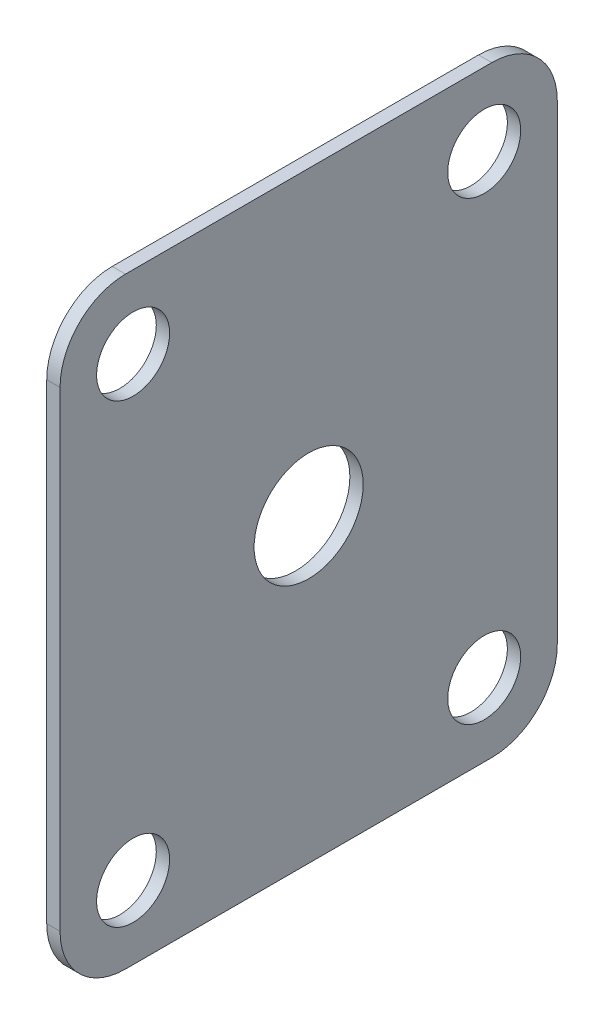
ISO-10303-21;
HEADER;
FILE_DESCRIPTION(('STEP AP214'),'2;1');
FILE_NAME('part.step','',(''),(''),'','','');
FILE_SCHEMA(('AUTOMOTIVE_DESIGN { 1 0 10303 214 1 1 1 1 }'));
ENDSEC;
DATA;
#1=APPLICATION_CONTEXT('core data for automotive mechanical design processes');
#2=APPLICATION_PROTOCOL_DEFINITION('international standard','automotive_design',2000,#1);
#3=PRODUCT_CONTEXT('',#1,'mechanical');
#4=PRODUCT('Part','Part','',(#3));
#5=PRODUCT_RELATED_PRODUCT_CATEGORY('part','',(#4));
#6=PRODUCT_DEFINITION_FORMATION('','',#4);
#7=PRODUCT_DEFINITION_CONTEXT('part definition',#1,'design');
#8=PRODUCT_DEFINITION('design','',#6,#7);
#9=PRODUCT_DEFINITION_SHAPE('','',#8);
#10=(LENGTH_UNIT() NAMED_UNIT(*) SI_UNIT(.MILLI.,.METRE.));
#11=(NAMED_UNIT(*) PLANE_ANGLE_UNIT() SI_UNIT($,.RADIAN.));
#12=(NAMED_UNIT(*) SI_UNIT($,.STERADIAN.) SOLID_ANGLE_UNIT());
#13=UNCERTAINTY_MEASURE_WITH_UNIT(LENGTH_MEASURE(1.E-05),#10,'distance_accuracy_value','');
#14=(GEOMETRIC_REPRESENTATION_CONTEXT(3) GLOBAL_UNCERTAINTY_ASSIGNED_CONTEXT((#13)) GLOBAL_UNIT_ASSIGNED_CONTEXT((#10,
#11,#12)) REPRESENTATION_CONTEXT('',''));
#15=CARTESIAN_POINT('',(0.,0.,0.));
#16=DIRECTION('',(0.,0.,1.));
#17=DIRECTION('',(1.,0.,0.));
#18=AXIS2_PLACEMENT_3D('',#15,#16,#17);
#19=CARTESIAN_POINT('',(1.5494,0.,0.));
#20=DIRECTION('',(-1.,0.,0.));
#21=DIRECTION('',(0.,0.,1.));
#22=AXIS2_PLACEMENT_3D('',#19,#20,#21);
#23=PLANE('',#22);
#24=DIRECTION('',(0.,0.,-1.));
#25=VECTOR('',#24,1.);
#26=CARTESIAN_POINT('',(1.5494,-35.052,28.956));
#27=LINE('',#26,#25);
#28=CARTESIAN_POINT('',(1.5494,-35.052,21.336));
#29=VERTEX_POINT('',#28);
#30=CARTESIAN_POINT('',(1.5494,-35.052,-21.336));
#31=VERTEX_POINT('',#30);
#32=EDGE_CURVE('E141',#29,#31,#27,.T.);
#33=ORIENTED_EDGE('',*,*,#32,.T.);
#34=CARTESIAN_POINT('',(1.5494,-27.432,-21.336));
#35=DIRECTION('',(-1.,0.,0.));
#36=DIRECTION('',(0.,0.,1.));
#37=AXIS2_PLACEMENT_3D('',#34,#35,#36);
#38=CIRCLE('',#37,7.62);
#39=CARTESIAN_POINT('',(1.5494,-27.432,-28.956));
#40=VERTEX_POINT('',#39);
#41=EDGE_CURVE('E159',#31,#40,#38,.F.);
#42=ORIENTED_EDGE('',*,*,#41,.T.);
#43=DIRECTION('',(0.,1.,0.));
#44=VECTOR('',#43,1.);
#45=CARTESIAN_POINT('',(1.5494,-35.052,-28.956));
#46=LINE('',#45,#44);
#47=CARTESIAN_POINT('',(1.5494,27.432,-28.956));
#48=VERTEX_POINT('',#47);
#49=EDGE_CURVE('E123',#40,#48,#46,.T.);
#50=ORIENTED_EDGE('',*,*,#49,.T.);
#51=CARTESIAN_POINT('',(1.5494,27.432,-21.336));
#52=DIRECTION('',(-1.,0.,0.));
#53=DIRECTION('',(0.,0.,1.));
#54=AXIS2_PLACEMENT_3D('',#51,#52,#53);
#55=CIRCLE('',#54,7.62);
#56=CARTESIAN_POINT('',(1.5494,35.052,-21.336));
#57=VERTEX_POINT('',#56);
#58=EDGE_CURVE('E155',#48,#57,#55,.F.);
#59=ORIENTED_EDGE('',*,*,#58,.T.);
#60=DIRECTION('',(0.,0.,1.));
#61=VECTOR('',#60,1.);
#62=CARTESIAN_POINT('',(1.5494,35.052,28.956));
#63=LINE('',#62,#61);
#64=CARTESIAN_POINT('',(1.5494,35.052,21.336));
#65=VERTEX_POINT('',#64);
#66=EDGE_CURVE('E168',#57,#65,#63,.T.);
#67=ORIENTED_EDGE('',*,*,#66,.T.);
#68=CARTESIAN_POINT('',(1.5494,27.432,21.336));
#69=DIRECTION('',(-1.,0.,0.));
#70=DIRECTION('',(0.,0.,1.));
#71=AXIS2_PLACEMENT_3D('',#68,#69,#70);
#72=CIRCLE('',#71,7.62);
#73=CARTESIAN_POINT('',(1.5494,27.432,28.956));
#74=VERTEX_POINT('',#73);
#75=EDGE_CURVE('E58',#65,#74,#72,.F.);
#76=ORIENTED_EDGE('',*,*,#75,.T.);
#77=DIRECTION('',(0.,-1.,0.));
#78=VECTOR('',#77,1.);
#79=CARTESIAN_POINT('',(1.5494,-35.052,28.956));
#80=LINE('',#79,#78);
#81=CARTESIAN_POINT('',(1.5494,-27.432,28.956));
#82=VERTEX_POINT('',#81);
#83=EDGE_CURVE('E174',#74,#82,#80,.T.);
#84=ORIENTED_EDGE('',*,*,#83,.T.);
#85=CARTESIAN_POINT('',(1.5494,-27.432,21.336));
#86=DIRECTION('',(-1.,0.,0.));
#87=DIRECTION('',(0.,0.,1.));
#88=AXIS2_PLACEMENT_3D('',#85,#86,#87);
#89=CIRCLE('',#88,7.62);
#90=EDGE_CURVE('E157',#82,#29,#89,.F.);
#91=ORIENTED_EDGE('',*,*,#90,.T.);
#92=EDGE_LOOP('',(#33,#42,#50,#59,#67,#76,#84,#91));
#93=FACE_BOUND('',#92,.T.);
#94=CARTESIAN_POINT('',(1.5494,26.543,20.447));
#95=DIRECTION('',(1.,0.,0.));
#96=DIRECTION('',(0.,0.,-1.));
#97=AXIS2_PLACEMENT_3D('',#94,#95,#96);
#98=CIRCLE('',#97,4.25);
#99=CARTESIAN_POINT('',(1.5494,26.543,16.197));
#100=VERTEX_POINT('',#99);
#101=EDGE_CURVE('E132',#100,#100,#98,.T.);
#102=ORIENTED_EDGE('',*,*,#101,.F.);
#103=EDGE_LOOP('',(#102));
#104=FACE_BOUND('',#103,.T.);
#105=CARTESIAN_POINT('',(1.5494,26.543,-20.447));
#106=DIRECTION('',(1.,0.,0.));
#107=DIRECTION('',(0.,0.,-1.));
#108=AXIS2_PLACEMENT_3D('',#105,#106,#107);
#109=CIRCLE('',#108,4.25);
#110=CARTESIAN_POINT('',(1.5494,26.543,-24.697));
#111=VERTEX_POINT('',#110);
#112=EDGE_CURVE('E189',#111,#111,#109,.T.);
#113=ORIENTED_EDGE('',*,*,#112,.F.);
#114=EDGE_LOOP('',(#113));
#115=FACE_BOUND('',#114,.T.);
#116=CARTESIAN_POINT('',(1.5494,-26.543,-20.447));
#117=DIRECTION('',(1.,0.,0.));
#118=DIRECTION('',(0.,0.,-1.));
#119=AXIS2_PLACEMENT_3D('',#116,#117,#118);
#120=CIRCLE('',#119,4.25);
#121=CARTESIAN_POINT('',(1.5494,-26.543,-24.697));
#122=VERTEX_POINT('',#121);
#123=EDGE_CURVE('E194',#122,#122,#120,.T.);
#124=ORIENTED_EDGE('',*,*,#123,.F.);
#125=EDGE_LOOP('',(#124));
#126=FACE_BOUND('',#125,.T.);
#127=CARTESIAN_POINT('',(1.5494,-26.543,20.447));
#128=DIRECTION('',(1.,0.,0.));
#129=DIRECTION('',(0.,0.,-1.));
#130=AXIS2_PLACEMENT_3D('',#127,#128,#129);
#131=CIRCLE('',#130,4.25);
#132=CARTESIAN_POINT('',(1.5494,-26.543,16.197));
#133=VERTEX_POINT('',#132);
#134=EDGE_CURVE('E200',#133,#133,#131,.T.);
#135=ORIENTED_EDGE('',*,*,#134,.F.);
#136=EDGE_LOOP('',(#135));
#137=FACE_BOUND('',#136,.T.);
#138=CARTESIAN_POINT('',(1.5494,0.,0.));
#139=DIRECTION('',(1.,0.,0.));
#140=DIRECTION('',(0.,0.,-1.));
#141=AXIS2_PLACEMENT_3D('',#138,#139,#140);
#142=CIRCLE('',#141,6.35);
#143=CARTESIAN_POINT('',(1.5494,0.,-6.34999999999999));
#144=VERTEX_POINT('',#143);
#145=EDGE_CURVE('E206',#144,#144,#142,.T.);
#146=ORIENTED_EDGE('',*,*,#145,.F.);
#147=EDGE_LOOP('',(#146));
#148=FACE_BOUND('',#147,.T.);
#149=ADVANCED_FACE('F36',(#93,#104,#115,#126,#137,#148),#23,.F.);
#150=CARTESIAN_POINT('',(0.,0.,0.));
#151=DIRECTION('',(-1.,0.,0.));
#152=DIRECTION('',(0.,0.,1.));
#153=AXIS2_PLACEMENT_3D('',#150,#151,#152);
#154=PLANE('',#153);
#155=CARTESIAN_POINT('',(0.,-26.543,20.447));
#156=DIRECTION('',(1.,0.,0.));
#157=DIRECTION('',(0.,0.,-1.));
#158=AXIS2_PLACEMENT_3D('',#155,#156,#157);
#159=CIRCLE('',#158,4.25);
#160=CARTESIAN_POINT('',(0.,-26.543,16.197));
#161=VERTEX_POINT('',#160);
#162=EDGE_CURVE('E203',#161,#161,#159,.T.);
#163=ORIENTED_EDGE('',*,*,#162,.T.);
#164=EDGE_LOOP('',(#163));
#165=FACE_BOUND('',#164,.T.);
#166=CARTESIAN_POINT('',(0.,26.543,-20.447));
#167=DIRECTION('',(1.,0.,0.));
#168=DIRECTION('',(0.,0.,-1.));
#169=AXIS2_PLACEMENT_3D('',#166,#167,#168);
#170=CIRCLE('',#169,4.25);
#171=CARTESIAN_POINT('',(0.,26.543,-24.697));
#172=VERTEX_POINT('',#171);
#173=EDGE_CURVE('E191',#172,#172,#170,.T.);
#174=ORIENTED_EDGE('',*,*,#173,.T.);
#175=EDGE_LOOP('',(#174));
#176=FACE_BOUND('',#175,.T.);
#177=DIRECTION('',(0.,1.,0.));
#178=VECTOR('',#177,1.);
#179=CARTESIAN_POINT('',(0.,-35.052,-28.956));
#180=LINE('',#179,#178);
#181=CARTESIAN_POINT('',(0.,-27.432,-28.956));
#182=VERTEX_POINT('',#181);
#183=CARTESIAN_POINT('',(0.,27.432,-28.956));
#184=VERTEX_POINT('',#183);
#185=EDGE_CURVE('E120',#182,#184,#180,.T.);
#186=ORIENTED_EDGE('',*,*,#185,.F.);
#187=CARTESIAN_POINT('',(0.,-27.432,-21.336));
#188=DIRECTION('',(-1.,0.,0.));
#189=DIRECTION('',(0.,0.,1.));
#190=AXIS2_PLACEMENT_3D('',#187,#188,#189);
#191=CIRCLE('',#190,7.62);
#192=CARTESIAN_POINT('',(0.,-35.052,-21.336));
#193=VERTEX_POINT('',#192);
#194=EDGE_CURVE('E103',#182,#193,#191,.T.);
#195=ORIENTED_EDGE('',*,*,#194,.T.);
#196=DIRECTION('',(0.,0.,-1.));
#197=VECTOR('',#196,1.);
#198=CARTESIAN_POINT('',(0.,-35.052,28.956));
#199=LINE('',#198,#197);
#200=CARTESIAN_POINT('',(0.,-35.052,21.336));
#201=VERTEX_POINT('',#200);
#202=EDGE_CURVE('E145',#201,#193,#199,.T.);
#203=ORIENTED_EDGE('',*,*,#202,.F.);
#204=CARTESIAN_POINT('',(0.,-27.432,21.336));
#205=DIRECTION('',(-1.,0.,0.));
#206=DIRECTION('',(0.,0.,1.));
#207=AXIS2_PLACEMENT_3D('',#204,#205,#206);
#208=CIRCLE('',#207,7.62);
#209=CARTESIAN_POINT('',(0.,-27.432,28.956));
#210=VERTEX_POINT('',#209);
#211=EDGE_CURVE('E114',#201,#210,#208,.T.);
#212=ORIENTED_EDGE('',*,*,#211,.T.);
#213=DIRECTION('',(0.,-1.,0.));
#214=VECTOR('',#213,1.);
#215=CARTESIAN_POINT('',(0.,-35.052,28.956));
#216=LINE('',#215,#214);
#217=CARTESIAN_POINT('',(0.,27.432,28.956));
#218=VERTEX_POINT('',#217);
#219=EDGE_CURVE('E135',#218,#210,#216,.T.);
#220=ORIENTED_EDGE('',*,*,#219,.F.);
#221=CARTESIAN_POINT('',(0.,27.432,21.336));
#222=DIRECTION('',(-1.,0.,0.));
#223=DIRECTION('',(0.,0.,1.));
#224=AXIS2_PLACEMENT_3D('',#221,#222,#223);
#225=CIRCLE('',#224,7.62);
#226=CARTESIAN_POINT('',(0.,35.052,21.336));
#227=VERTEX_POINT('',#226);
#228=EDGE_CURVE('E124',#218,#227,#225,.T.);
#229=ORIENTED_EDGE('',*,*,#228,.T.);
#230=DIRECTION('',(0.,0.,1.));
#231=VECTOR('',#230,1.);
#232=CARTESIAN_POINT('',(0.,35.052,28.956));
#233=LINE('',#232,#231);
#234=CARTESIAN_POINT('',(0.,35.052,-21.336));
#235=VERTEX_POINT('',#234);
#236=EDGE_CURVE('E131',#235,#227,#233,.T.);
#237=ORIENTED_EDGE('',*,*,#236,.F.);
#238=CARTESIAN_POINT('',(0.,27.432,-21.336));
#239=DIRECTION('',(-1.,0.,0.));
#240=DIRECTION('',(0.,0.,1.));
#241=AXIS2_PLACEMENT_3D('',#238,#239,#240);
#242=CIRCLE('',#241,7.62);
#243=EDGE_CURVE('E130',#235,#184,#242,.T.);
#244=ORIENTED_EDGE('',*,*,#243,.T.);
#245=EDGE_LOOP('',(#186,#195,#203,#212,#220,#229,#237,#244));
#246=FACE_BOUND('',#245,.T.);
#247=CARTESIAN_POINT('',(0.,26.543,20.447));
#248=DIRECTION('',(1.,0.,0.));
#249=DIRECTION('',(0.,0.,-1.));
#250=AXIS2_PLACEMENT_3D('',#247,#248,#249);
#251=CIRCLE('',#250,4.25);
#252=CARTESIAN_POINT('',(0.,26.543,16.197));
#253=VERTEX_POINT('',#252);
#254=EDGE_CURVE('E138',#253,#253,#251,.T.);
#255=ORIENTED_EDGE('',*,*,#254,.T.);
#256=EDGE_LOOP('',(#255));
#257=FACE_BOUND('',#256,.T.);
#258=CARTESIAN_POINT('',(0.,-26.543,-20.447));
#259=DIRECTION('',(1.,0.,0.));
#260=DIRECTION('',(0.,0.,-1.));
#261=AXIS2_PLACEMENT_3D('',#258,#259,#260);
#262=CIRCLE('',#261,4.25);
#263=CARTESIAN_POINT('',(0.,-26.543,-24.697));
#264=VERTEX_POINT('',#263);
#265=EDGE_CURVE('E197',#264,#264,#262,.T.);
#266=ORIENTED_EDGE('',*,*,#265,.T.);
#267=EDGE_LOOP('',(#266));
#268=FACE_BOUND('',#267,.T.);
#269=CARTESIAN_POINT('',(0.,0.,0.));
#270=DIRECTION('',(1.,0.,0.));
#271=DIRECTION('',(0.,0.,-1.));
#272=AXIS2_PLACEMENT_3D('',#269,#270,#271);
#273=CIRCLE('',#272,6.35);
#274=CARTESIAN_POINT('',(0.,0.,-6.34999999999999));
#275=VERTEX_POINT('',#274);
#276=EDGE_CURVE('E209',#275,#275,#273,.T.);
#277=ORIENTED_EDGE('',*,*,#276,.T.);
#278=EDGE_LOOP('',(#277));
#279=FACE_BOUND('',#278,.T.);
#280=ADVANCED_FACE('F127',(#165,#176,#246,#257,#268,#279),#154,.T.);
#281=CARTESIAN_POINT('',(1.5494,-35.052,-28.956));
#282=DIRECTION('',(0.,0.,1.));
#283=DIRECTION('',(1.,0.,0.));
#284=AXIS2_PLACEMENT_3D('',#281,#282,#283);
#285=PLANE('',#284);
#286=ORIENTED_EDGE('',*,*,#49,.F.);
#287=DIRECTION('',(-1.,0.,0.));
#288=VECTOR('',#287,1.);
#289=CARTESIAN_POINT('',(1.5494,-27.432,-28.956));
#290=LINE('',#289,#288);
#291=EDGE_CURVE('E107',#40,#182,#290,.T.);
#292=ORIENTED_EDGE('',*,*,#291,.T.);
#293=ORIENTED_EDGE('',*,*,#185,.T.);
#294=DIRECTION('',(-1.,0.,0.));
#295=VECTOR('',#294,1.);
#296=CARTESIAN_POINT('',(1.5494,27.432,-28.956));
#297=LINE('',#296,#295);
#298=EDGE_CURVE('E125',#184,#48,#297,.F.);
#299=ORIENTED_EDGE('',*,*,#298,.T.);
#300=EDGE_LOOP('',(#286,#292,#293,#299));
#301=FACE_BOUND('',#300,.T.);
#302=ADVANCED_FACE('F119',(#301),#285,.F.);
#303=CARTESIAN_POINT('',(1.5494,35.052,28.956));
#304=DIRECTION('',(0.,-1.,0.));
#305=DIRECTION('',(0.,0.,-1.));
#306=AXIS2_PLACEMENT_3D('',#303,#304,#305);
#307=PLANE('',#306);
#308=ORIENTED_EDGE('',*,*,#66,.F.);
#309=DIRECTION('',(-1.,0.,0.));
#310=VECTOR('',#309,1.);
#311=CARTESIAN_POINT('',(1.5494,35.052,-21.336));
#312=LINE('',#311,#310);
#313=EDGE_CURVE('E11',#57,#235,#312,.T.);
#314=ORIENTED_EDGE('',*,*,#313,.T.);
#315=ORIENTED_EDGE('',*,*,#236,.T.);
#316=DIRECTION('',(-1.,0.,0.));
#317=VECTOR('',#316,1.);
#318=CARTESIAN_POINT('',(1.5494,35.052,21.336));
#319=LINE('',#318,#317);
#320=EDGE_CURVE('E44',#227,#65,#319,.F.);
#321=ORIENTED_EDGE('',*,*,#320,.T.);
#322=EDGE_LOOP('',(#308,#314,#315,#321));
#323=FACE_BOUND('',#322,.T.);
#324=ADVANCED_FACE('F167',(#323),#307,.F.);
#325=CARTESIAN_POINT('',(1.5494,-35.052,28.956));
#326=DIRECTION('',(0.,0.,-1.));
#327=DIRECTION('',(-1.,0.,0.));
#328=AXIS2_PLACEMENT_3D('',#325,#326,#327);
#329=PLANE('',#328);
#330=ORIENTED_EDGE('',*,*,#219,.T.);
#331=DIRECTION('',(-1.,0.,0.));
#332=VECTOR('',#331,1.);
#333=CARTESIAN_POINT('',(1.5494,-27.432,28.956));
#334=LINE('',#333,#332);
#335=EDGE_CURVE('E51',#210,#82,#334,.F.);
#336=ORIENTED_EDGE('',*,*,#335,.T.);
#337=ORIENTED_EDGE('',*,*,#83,.F.);
#338=DIRECTION('',(-1.,0.,0.));
#339=VECTOR('',#338,1.);
#340=CARTESIAN_POINT('',(1.5494,27.432,28.956));
#341=LINE('',#340,#339);
#342=EDGE_CURVE('E161',#74,#218,#341,.T.);
#343=ORIENTED_EDGE('',*,*,#342,.T.);
#344=EDGE_LOOP('',(#330,#336,#337,#343));
#345=FACE_BOUND('',#344,.T.);
#346=ADVANCED_FACE('F178',(#345),#329,.F.);
#347=CARTESIAN_POINT('',(1.5494,-35.052,28.956));
#348=DIRECTION('',(0.,1.,0.));
#349=DIRECTION('',(0.,0.,1.));
#350=AXIS2_PLACEMENT_3D('',#347,#348,#349);
#351=PLANE('',#350);
#352=ORIENTED_EDGE('',*,*,#202,.T.);
#353=DIRECTION('',(-1.,0.,0.));
#354=VECTOR('',#353,1.);
#355=CARTESIAN_POINT('',(1.5494,-35.052,-21.336));
#356=LINE('',#355,#354);
#357=EDGE_CURVE('E108',#193,#31,#356,.F.);
#358=ORIENTED_EDGE('',*,*,#357,.T.);
#359=ORIENTED_EDGE('',*,*,#32,.F.);
#360=DIRECTION('',(-1.,0.,0.));
#361=VECTOR('',#360,1.);
#362=CARTESIAN_POINT('',(1.5494,-35.052,21.336));
#363=LINE('',#362,#361);
#364=EDGE_CURVE('E113',#29,#201,#363,.T.);
#365=ORIENTED_EDGE('',*,*,#364,.T.);
#366=EDGE_LOOP('',(#352,#358,#359,#365));
#367=FACE_BOUND('',#366,.T.);
#368=ADVANCED_FACE('F185',(#367),#351,.F.);
#369=CARTESIAN_POINT('',(1.5494,26.543,20.447));
#370=DIRECTION('',(-1.,0.,0.));
#371=DIRECTION('',(0.,0.,1.));
#372=AXIS2_PLACEMENT_3D('',#369,#370,#371);
#373=CYLINDRICAL_SURFACE('',#372,4.25);
#374=ORIENTED_EDGE('',*,*,#101,.T.);
#375=EDGE_LOOP('',(#374));
#376=FACE_BOUND('',#375,.T.);
#377=ORIENTED_EDGE('',*,*,#254,.F.);
#378=EDGE_LOOP('',(#377));
#379=FACE_BOUND('',#378,.T.);
#380=ADVANCED_FACE('F226',(#376,#379),#373,.F.);
#381=CARTESIAN_POINT('',(1.5494,26.543,-20.447));
#382=DIRECTION('',(-1.,0.,0.));
#383=DIRECTION('',(0.,0.,1.));
#384=AXIS2_PLACEMENT_3D('',#381,#382,#383);
#385=CYLINDRICAL_SURFACE('',#384,4.25);
#386=ORIENTED_EDGE('',*,*,#112,.T.);
#387=EDGE_LOOP('',(#386));
#388=FACE_BOUND('',#387,.T.);
#389=ORIENTED_EDGE('',*,*,#173,.F.);
#390=EDGE_LOOP('',(#389));
#391=FACE_BOUND('',#390,.T.);
#392=ADVANCED_FACE('F328',(#388,#391),#385,.F.);
#393=CARTESIAN_POINT('',(1.5494,-26.543,-20.447));
#394=DIRECTION('',(-1.,0.,0.));
#395=DIRECTION('',(0.,0.,1.));
#396=AXIS2_PLACEMENT_3D('',#393,#394,#395);
#397=CYLINDRICAL_SURFACE('',#396,4.25);
#398=ORIENTED_EDGE('',*,*,#123,.T.);
#399=EDGE_LOOP('',(#398));
#400=FACE_BOUND('',#399,.T.);
#401=ORIENTED_EDGE('',*,*,#265,.F.);
#402=EDGE_LOOP('',(#401));
#403=FACE_BOUND('',#402,.T.);
#404=ADVANCED_FACE('F318',(#400,#403),#397,.F.);
#405=CARTESIAN_POINT('',(1.5494,-26.543,20.447));
#406=DIRECTION('',(-1.,0.,0.));
#407=DIRECTION('',(0.,0.,1.));
#408=AXIS2_PLACEMENT_3D('',#405,#406,#407);
#409=CYLINDRICAL_SURFACE('',#408,4.25);
#410=ORIENTED_EDGE('',*,*,#134,.T.);
#411=EDGE_LOOP('',(#410));
#412=FACE_BOUND('',#411,.T.);
#413=ORIENTED_EDGE('',*,*,#162,.F.);
#414=EDGE_LOOP('',(#413));
#415=FACE_BOUND('',#414,.T.);
#416=ADVANCED_FACE('F309',(#412,#415),#409,.F.);
#417=CARTESIAN_POINT('',(1.5494,0.,0.));
#418=DIRECTION('',(-1.,0.,0.));
#419=DIRECTION('',(0.,0.,1.));
#420=AXIS2_PLACEMENT_3D('',#417,#418,#419);
#421=CYLINDRICAL_SURFACE('',#420,6.35);
#422=ORIENTED_EDGE('',*,*,#145,.T.);
#423=EDGE_LOOP('',(#422));
#424=FACE_BOUND('',#423,.T.);
#425=ORIENTED_EDGE('',*,*,#276,.F.);
#426=EDGE_LOOP('',(#425));
#427=FACE_BOUND('',#426,.T.);
#428=ADVANCED_FACE('F215',(#424,#427),#421,.F.);
#429=CARTESIAN_POINT('',(1.5494,-27.432,-21.336));
#430=DIRECTION('',(-1.,0.,0.));
#431=DIRECTION('',(0.,0.,1.));
#432=AXIS2_PLACEMENT_3D('',#429,#430,#431);
#433=CYLINDRICAL_SURFACE('',#432,7.62);
#434=ORIENTED_EDGE('',*,*,#41,.F.);
#435=ORIENTED_EDGE('',*,*,#357,.F.);
#436=ORIENTED_EDGE('',*,*,#194,.F.);
#437=ORIENTED_EDGE('',*,*,#291,.F.);
#438=EDGE_LOOP('',(#434,#435,#436,#437));
#439=FACE_BOUND('',#438,.T.);
#440=ADVANCED_FACE('F106',(#439),#433,.T.);
#441=CARTESIAN_POINT('',(1.5494,-27.432,21.336));
#442=DIRECTION('',(-1.,0.,0.));
#443=DIRECTION('',(0.,0.,1.));
#444=AXIS2_PLACEMENT_3D('',#441,#442,#443);
#445=CYLINDRICAL_SURFACE('',#444,7.62);
#446=ORIENTED_EDGE('',*,*,#90,.F.);
#447=ORIENTED_EDGE('',*,*,#335,.F.);
#448=ORIENTED_EDGE('',*,*,#211,.F.);
#449=ORIENTED_EDGE('',*,*,#364,.F.);
#450=EDGE_LOOP('',(#446,#447,#448,#449));
#451=FACE_BOUND('',#450,.T.);
#452=ADVANCED_FACE('F182',(#451),#445,.T.);
#453=CARTESIAN_POINT('',(1.5494,27.432,-21.336));
#454=DIRECTION('',(-1.,0.,0.));
#455=DIRECTION('',(0.,0.,1.));
#456=AXIS2_PLACEMENT_3D('',#453,#454,#455);
#457=CYLINDRICAL_SURFACE('',#456,7.62);
#458=ORIENTED_EDGE('',*,*,#58,.F.);
#459=ORIENTED_EDGE('',*,*,#298,.F.);
#460=ORIENTED_EDGE('',*,*,#243,.F.);
#461=ORIENTED_EDGE('',*,*,#313,.F.);
#462=EDGE_LOOP('',(#458,#459,#460,#461));
#463=FACE_BOUND('',#462,.T.);
#464=ADVANCED_FACE('F240',(#463),#457,.T.);
#465=CARTESIAN_POINT('',(1.5494,27.432,21.336));
#466=DIRECTION('',(-1.,0.,0.));
#467=DIRECTION('',(0.,0.,1.));
#468=AXIS2_PLACEMENT_3D('',#465,#466,#467);
#469=CYLINDRICAL_SURFACE('',#468,7.62);
#470=ORIENTED_EDGE('',*,*,#75,.F.);
#471=ORIENTED_EDGE('',*,*,#320,.F.);
#472=ORIENTED_EDGE('',*,*,#228,.F.);
#473=ORIENTED_EDGE('',*,*,#342,.F.);
#474=EDGE_LOOP('',(#470,#471,#472,#473));
#475=FACE_BOUND('',#474,.T.);
#476=ADVANCED_FACE('F38',(#475),#469,.T.);
#477=CLOSED_SHELL('',(#149,#280,#302,#324,#346,#368,#380,#392,#404,#416,#428,#440,#452,#464,#476));
#478=MANIFOLD_SOLID_BREP('B2',#477);
#479=ADVANCED_BREP_SHAPE_REPRESENTATION('',(#18,#478),#14);
#480=SHAPE_DEFINITION_REPRESENTATION(#9,#479);
ENDSEC;
END-ISO-10303-21;
